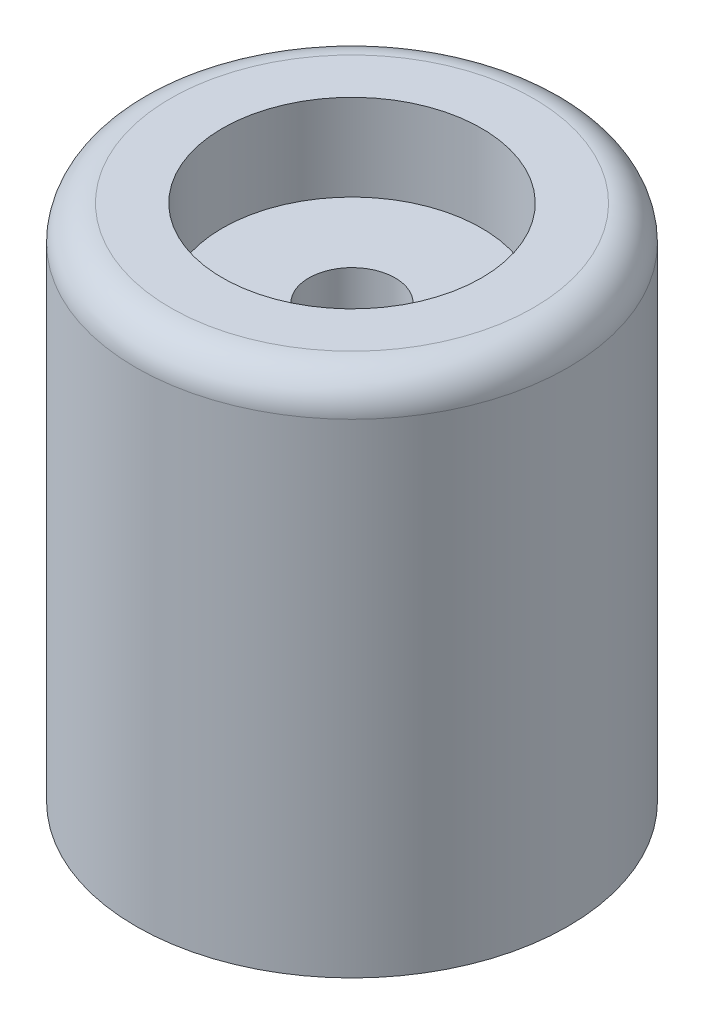
ISO-10303-21;
HEADER;
FILE_DESCRIPTION(('STEP AP214'),'2;1');
FILE_NAME('part.step','',(''),(''),'','','');
FILE_SCHEMA(('AUTOMOTIVE_DESIGN { 1 0 10303 214 1 1 1 1 }'));
ENDSEC;
DATA;
#1=APPLICATION_CONTEXT('core data for automotive mechanical design processes');
#2=APPLICATION_PROTOCOL_DEFINITION('international standard','automotive_design',2000,#1);
#3=PRODUCT_CONTEXT('',#1,'mechanical');
#4=PRODUCT('Part','Part','',(#3));
#5=PRODUCT_RELATED_PRODUCT_CATEGORY('part','',(#4));
#6=PRODUCT_DEFINITION_FORMATION('','',#4);
#7=PRODUCT_DEFINITION_CONTEXT('part definition',#1,'design');
#8=PRODUCT_DEFINITION('design','',#6,#7);
#9=PRODUCT_DEFINITION_SHAPE('','',#8);
#10=(LENGTH_UNIT() NAMED_UNIT(*) SI_UNIT(.MILLI.,.METRE.));
#11=(NAMED_UNIT(*) PLANE_ANGLE_UNIT() SI_UNIT($,.RADIAN.));
#12=(NAMED_UNIT(*) SI_UNIT($,.STERADIAN.) SOLID_ANGLE_UNIT());
#13=UNCERTAINTY_MEASURE_WITH_UNIT(LENGTH_MEASURE(1.E-05),#10,'distance_accuracy_value','');
#14=(GEOMETRIC_REPRESENTATION_CONTEXT(3) GLOBAL_UNCERTAINTY_ASSIGNED_CONTEXT((#13)) GLOBAL_UNIT_ASSIGNED_CONTEXT((#10,
#11,#12)) REPRESENTATION_CONTEXT('',''));
#15=CARTESIAN_POINT('',(0.,0.,0.));
#16=DIRECTION('',(0.,0.,1.));
#17=DIRECTION('',(1.,0.,0.));
#18=AXIS2_PLACEMENT_3D('',#15,#16,#17);
#19=CARTESIAN_POINT('',(0.,0.,0.));
#20=DIRECTION('',(0.,-1.,0.));
#21=DIRECTION('',(1.,0.,0.));
#22=AXIS2_PLACEMENT_3D('',#19,#20,#21);
#23=CYLINDRICAL_SURFACE('',#22,9.52499999999988);
#24=CARTESIAN_POINT('',(-1.33096572576666E-13,38.1,0.));
#25=DIRECTION('',(0.,-1.,0.));
#26=DIRECTION('',(1.,0.,0.));
#27=AXIS2_PLACEMENT_3D('',#24,#25,#26);
#28=CIRCLE('',#27,9.52499999999987);
#29=CARTESIAN_POINT('',(9.52499999999973,38.1000000000001,0.));
#30=VERTEX_POINT('',#29);
#31=EDGE_CURVE('E48',#30,#30,#28,.T.);
#32=ORIENTED_EDGE('',*,*,#31,.F.);
#33=EDGE_LOOP('',(#32));
#34=FACE_BOUND('',#33,.T.);
#35=CARTESIAN_POINT('',(-1.10913810480555E-13,31.75,0.));
#36=DIRECTION('',(0.,-1.,0.));
#37=DIRECTION('',(1.,0.,0.));
#38=AXIS2_PLACEMENT_3D('',#35,#36,#37);
#39=CIRCLE('',#38,9.52499999999989);
#40=CARTESIAN_POINT('',(9.52499999999978,31.7500000000001,0.));
#41=VERTEX_POINT('',#40);
#42=EDGE_CURVE('E66',#41,#41,#39,.T.);
#43=ORIENTED_EDGE('',*,*,#42,.T.);
#44=EDGE_LOOP('',(#43));
#45=FACE_BOUND('',#44,.T.);
#46=ADVANCED_FACE('F34',(#34,#45),#23,.F.);
#47=CARTESIAN_POINT('',(-9.525,38.1,0.));
#48=DIRECTION('',(0.,-1.,0.));
#49=DIRECTION('',(1.,0.,0.));
#50=AXIS2_PLACEMENT_3D('',#47,#48,#49);
#51=PLANE('',#50);
#52=CARTESIAN_POINT('',(-1.33096572576666E-13,38.1,0.));
#53=DIRECTION('',(0.,-1.,0.));
#54=DIRECTION('',(1.,0.,0.));
#55=AXIS2_PLACEMENT_3D('',#52,#53,#54);
#56=CIRCLE('',#55,13.3349999999999);
#57=CARTESIAN_POINT('',(13.3349999999998,38.1000000000001,0.));
#58=VERTEX_POINT('',#57);
#59=EDGE_CURVE('E10',#58,#58,#56,.F.);
#60=ORIENTED_EDGE('',*,*,#59,.T.);
#61=EDGE_LOOP('',(#60));
#62=FACE_BOUND('',#61,.T.);
#63=ORIENTED_EDGE('',*,*,#31,.T.);
#64=EDGE_LOOP('',(#63));
#65=FACE_BOUND('',#64,.T.);
#66=ADVANCED_FACE('F91',(#62,#65),#51,.F.);
#67=CARTESIAN_POINT('',(0.,0.,0.));
#68=DIRECTION('',(0.,-1.,0.));
#69=DIRECTION('',(1.,0.,0.));
#70=AXIS2_PLACEMENT_3D('',#67,#68,#69);
#71=CYLINDRICAL_SURFACE('',#70,15.8749999999999);
#72=CARTESIAN_POINT('',(-1.24223467738222E-13,35.56,0.));
#73=DIRECTION('',(0.,-1.,0.));
#74=DIRECTION('',(1.,0.,0.));
#75=AXIS2_PLACEMENT_3D('',#72,#73,#74);
#76=CIRCLE('',#75,15.8749999999999);
#77=CARTESIAN_POINT('',(15.8749999999998,35.5600000000001,0.));
#78=VERTEX_POINT('',#77);
#79=EDGE_CURVE('E42',#78,#78,#76,.T.);
#80=ORIENTED_EDGE('',*,*,#79,.T.);
#81=EDGE_LOOP('',(#80));
#82=FACE_BOUND('',#81,.T.);
#83=CARTESIAN_POINT('',(0.,0.,0.));
#84=DIRECTION('',(0.,-1.,0.));
#85=DIRECTION('',(1.,0.,0.));
#86=AXIS2_PLACEMENT_3D('',#83,#84,#85);
#87=CIRCLE('',#86,15.875);
#88=CARTESIAN_POINT('',(15.875,1.10913810480555E-13,0.));
#89=VERTEX_POINT('',#88);
#90=EDGE_CURVE('E53',#89,#89,#87,.T.);
#91=ORIENTED_EDGE('',*,*,#90,.F.);
#92=EDGE_LOOP('',(#91));
#93=FACE_BOUND('',#92,.T.);
#94=ADVANCED_FACE('F86',(#82,#93),#71,.T.);
#95=CARTESIAN_POINT('',(-15.875,0.,0.));
#96=DIRECTION('',(0.,1.,0.));
#97=DIRECTION('',(-1.,0.,0.));
#98=AXIS2_PLACEMENT_3D('',#95,#96,#97);
#99=PLANE('',#98);
#100=CARTESIAN_POINT('',(0.,0.,0.));
#101=DIRECTION('',(0.,-1.,0.));
#102=DIRECTION('',(1.,0.,0.));
#103=AXIS2_PLACEMENT_3D('',#100,#101,#102);
#104=CIRCLE('',#103,3.175);
#105=CARTESIAN_POINT('',(3.175,0.,0.));
#106=VERTEX_POINT('',#105);
#107=EDGE_CURVE('E59',#106,#106,#104,.T.);
#108=ORIENTED_EDGE('',*,*,#107,.F.);
#109=EDGE_LOOP('',(#108));
#110=FACE_BOUND('',#109,.T.);
#111=ORIENTED_EDGE('',*,*,#90,.T.);
#112=EDGE_LOOP('',(#111));
#113=FACE_BOUND('',#112,.T.);
#114=ADVANCED_FACE('F80',(#110,#113),#99,.F.);
#115=CARTESIAN_POINT('',(0.,0.,0.));
#116=DIRECTION('',(0.,-1.,0.));
#117=DIRECTION('',(1.,0.,0.));
#118=AXIS2_PLACEMENT_3D('',#115,#116,#117);
#119=CYLINDRICAL_SURFACE('',#118,3.17499999999994);
#120=CARTESIAN_POINT('',(-1.10913810480555E-13,31.75,0.));
#121=DIRECTION('',(0.,-1.,0.));
#122=DIRECTION('',(1.,0.,0.));
#123=AXIS2_PLACEMENT_3D('',#120,#121,#122);
#124=CIRCLE('',#123,3.17499999999989);
#125=CARTESIAN_POINT('',(3.17499999999978,31.75,0.));
#126=VERTEX_POINT('',#125);
#127=EDGE_CURVE('E63',#126,#126,#124,.T.);
#128=ORIENTED_EDGE('',*,*,#127,.F.);
#129=EDGE_LOOP('',(#128));
#130=FACE_BOUND('',#129,.T.);
#131=ORIENTED_EDGE('',*,*,#107,.T.);
#132=EDGE_LOOP('',(#131));
#133=FACE_BOUND('',#132,.T.);
#134=ADVANCED_FACE('F74',(#130,#133),#119,.F.);
#135=CARTESIAN_POINT('',(-3.175,31.75,0.));
#136=DIRECTION('',(0.,-1.,0.));
#137=DIRECTION('',(1.,0.,0.));
#138=AXIS2_PLACEMENT_3D('',#135,#136,#137);
#139=PLANE('',#138);
#140=ORIENTED_EDGE('',*,*,#42,.F.);
#141=EDGE_LOOP('',(#140));
#142=FACE_BOUND('',#141,.T.);
#143=ORIENTED_EDGE('',*,*,#127,.T.);
#144=EDGE_LOOP('',(#143));
#145=FACE_BOUND('',#144,.T.);
#146=ADVANCED_FACE('F71',(#142,#145),#139,.F.);
#147=CARTESIAN_POINT('',(-1.24223467738222E-13,35.56,0.));
#148=DIRECTION('',(0.,-1.,0.));
#149=DIRECTION('',(1.,0.,0.));
#150=AXIS2_PLACEMENT_3D('',#147,#148,#149);
#151=TOROIDAL_SURFACE('',#150,13.3349999999999,2.54);
#152=ORIENTED_EDGE('',*,*,#59,.F.);
#153=EDGE_LOOP('',(#152));
#154=FACE_BOUND('',#153,.T.);
#155=ORIENTED_EDGE('',*,*,#79,.F.);
#156=EDGE_LOOP('',(#155));
#157=FACE_BOUND('',#156,.T.);
#158=ADVANCED_FACE('F36',(#154,#157),#151,.T.);
#159=CLOSED_SHELL('',(#46,#66,#94,#114,#134,#146,#158));
#160=MANIFOLD_SOLID_BREP('B2',#159);
#161=ADVANCED_BREP_SHAPE_REPRESENTATION('',(#18,#160),#14);
#162=SHAPE_DEFINITION_REPRESENTATION(#9,#161);
ENDSEC;
END-ISO-10303-21;
